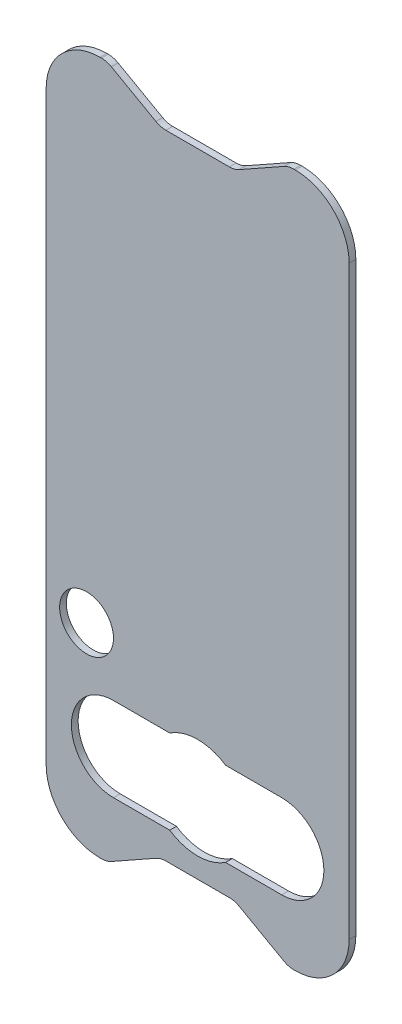
ISO-10303-21;
HEADER;
FILE_DESCRIPTION(('STEP AP214'),'2;1');
FILE_NAME('part.step','',(''),(''),'','','');
FILE_SCHEMA(('AUTOMOTIVE_DESIGN { 1 0 10303 214 1 1 1 1 }'));
ENDSEC;
DATA;
#1=APPLICATION_CONTEXT('core data for automotive mechanical design processes');
#2=APPLICATION_PROTOCOL_DEFINITION('international standard','automotive_design',2000,#1);
#3=PRODUCT_CONTEXT('',#1,'mechanical');
#4=PRODUCT('Part','Part','',(#3));
#5=PRODUCT_RELATED_PRODUCT_CATEGORY('part','',(#4));
#6=PRODUCT_DEFINITION_FORMATION('','',#4);
#7=PRODUCT_DEFINITION_CONTEXT('part definition',#1,'design');
#8=PRODUCT_DEFINITION('design','',#6,#7);
#9=PRODUCT_DEFINITION_SHAPE('','',#8);
#10=(LENGTH_UNIT() NAMED_UNIT(*) SI_UNIT(.MILLI.,.METRE.));
#11=(NAMED_UNIT(*) PLANE_ANGLE_UNIT() SI_UNIT($,.RADIAN.));
#12=(NAMED_UNIT(*) SI_UNIT($,.STERADIAN.) SOLID_ANGLE_UNIT());
#13=UNCERTAINTY_MEASURE_WITH_UNIT(LENGTH_MEASURE(1.E-05),#10,'distance_accuracy_value','');
#14=(GEOMETRIC_REPRESENTATION_CONTEXT(3) GLOBAL_UNCERTAINTY_ASSIGNED_CONTEXT((#13)) GLOBAL_UNIT_ASSIGNED_CONTEXT((#10,
#11,#12)) REPRESENTATION_CONTEXT('',''));
#15=CARTESIAN_POINT('',(0.,0.,0.));
#16=DIRECTION('',(0.,0.,1.));
#17=DIRECTION('',(1.,0.,0.));
#18=AXIS2_PLACEMENT_3D('',#15,#16,#17);
#19=CARTESIAN_POINT('',(0.,0.,1.));
#20=DIRECTION('',(0.,1.,0.));
#21=DIRECTION('',(0.,0.,1.));
#22=AXIS2_PLACEMENT_3D('',#19,#20,#21);
#23=PLANE('',#22);
#24=DIRECTION('',(1.,0.,0.));
#25=VECTOR('',#24,1.);
#26=CARTESIAN_POINT('',(0.,0.,1.));
#27=LINE('',#26,#25);
#28=CARTESIAN_POINT('',(36.7858532502286,0.,1.));
#29=VERTEX_POINT('',#28);
#30=CARTESIAN_POINT('',(37.,0.,1.));
#31=VERTEX_POINT('',#30);
#32=EDGE_CURVE('E358',#29,#31,#27,.T.);
#33=ORIENTED_EDGE('',*,*,#32,.F.);
#34=DIRECTION('',(0.,0.,1.));
#35=VECTOR('',#34,1.);
#36=CARTESIAN_POINT('',(36.7858532502286,0.,1.));
#37=LINE('',#36,#35);
#38=CARTESIAN_POINT('',(36.7858532502286,0.,0.));
#39=VERTEX_POINT('',#38);
#40=EDGE_CURVE('E456',#29,#39,#37,.F.);
#41=ORIENTED_EDGE('',*,*,#40,.T.);
#42=DIRECTION('',(1.,0.,0.));
#43=VECTOR('',#42,1.);
#44=CARTESIAN_POINT('',(0.,0.,0.));
#45=LINE('',#44,#43);
#46=CARTESIAN_POINT('',(37.,0.,0.));
#47=VERTEX_POINT('',#46);
#48=EDGE_CURVE('E373',#39,#47,#45,.T.);
#49=ORIENTED_EDGE('',*,*,#48,.T.);
#50=DIRECTION('',(0.,0.,-1.));
#51=VECTOR('',#50,1.);
#52=CARTESIAN_POINT('',(37.,0.,1.));
#53=LINE('',#52,#51);
#54=EDGE_CURVE('E370',#47,#31,#53,.F.);
#55=ORIENTED_EDGE('',*,*,#54,.T.);
#56=EDGE_LOOP('',(#33,#41,#49,#55));
#57=FACE_BOUND('',#56,.T.);
#58=ADVANCED_FACE('F33',(#57),#23,.F.);
#59=CARTESIAN_POINT('',(0.,103.,1.));
#60=DIRECTION('',(0.,-1.,0.));
#61=DIRECTION('',(0.,0.,-1.));
#62=AXIS2_PLACEMENT_3D('',#59,#60,#61);
#63=PLANE('',#62);
#64=DIRECTION('',(-1.,0.,0.));
#65=VECTOR('',#64,1.);
#66=CARTESIAN_POINT('',(0.,103.,0.));
#67=LINE('',#66,#65);
#68=CARTESIAN_POINT('',(37.,103.,0.));
#69=VERTEX_POINT('',#68);
#70=CARTESIAN_POINT('',(36.7858532502285,103.,0.));
#71=VERTEX_POINT('',#70);
#72=EDGE_CURVE('E359',#69,#71,#67,.T.);
#73=ORIENTED_EDGE('',*,*,#72,.T.);
#74=DIRECTION('',(0.,0.,1.));
#75=VECTOR('',#74,1.);
#76=CARTESIAN_POINT('',(36.7858532502286,103.,1.));
#77=LINE('',#76,#75);
#78=CARTESIAN_POINT('',(36.7858532502285,103.,1.));
#79=VERTEX_POINT('',#78);
#80=EDGE_CURVE('E458',#71,#79,#77,.T.);
#81=ORIENTED_EDGE('',*,*,#80,.T.);
#82=DIRECTION('',(-1.,0.,0.));
#83=VECTOR('',#82,1.);
#84=CARTESIAN_POINT('',(0.,103.,1.));
#85=LINE('',#84,#83);
#86=CARTESIAN_POINT('',(37.,103.,1.));
#87=VERTEX_POINT('',#86);
#88=EDGE_CURVE('E367',#87,#79,#85,.T.);
#89=ORIENTED_EDGE('',*,*,#88,.F.);
#90=DIRECTION('',(0.,0.,-1.));
#91=VECTOR('',#90,1.);
#92=CARTESIAN_POINT('',(37.,103.,1.));
#93=LINE('',#92,#91);
#94=EDGE_CURVE('E419',#87,#69,#93,.T.);
#95=ORIENTED_EDGE('',*,*,#94,.T.);
#96=EDGE_LOOP('',(#73,#81,#89,#95));
#97=FACE_BOUND('',#96,.T.);
#98=ADVANCED_FACE('F518',(#97),#63,.F.);
#99=CARTESIAN_POINT('',(0.,0.,1.));
#100=DIRECTION('',(0.,0.,-1.));
#101=DIRECTION('',(-1.,0.,0.));
#102=AXIS2_PLACEMENT_3D('',#99,#100,#101);
#103=PLANE('',#102);
#104=CARTESIAN_POINT('',(5.99999999999999,29.25,1.));
#105=DIRECTION('',(0.,0.,1.));
#106=DIRECTION('',(1.,0.,0.));
#107=AXIS2_PLACEMENT_3D('',#104,#105,#106);
#108=CIRCLE('',#107,4.);
#109=CARTESIAN_POINT('',(9.99999999999999,29.25,1.));
#110=VERTEX_POINT('',#109);
#111=EDGE_CURVE('E324',#110,#110,#108,.T.);
#112=ORIENTED_EDGE('',*,*,#111,.F.);
#113=EDGE_LOOP('',(#112));
#114=FACE_BOUND('',#113,.T.);
#115=CARTESIAN_POINT('',(8.,0.,1.));
#116=VERTEX_POINT('',#115);
#117=CARTESIAN_POINT('',(8.21414674977138,0.,1.));
#118=VERTEX_POINT('',#117);
#119=EDGE_CURVE('E360',#116,#118,#27,.T.);
#120=ORIENTED_EDGE('',*,*,#119,.T.);
#121=CARTESIAN_POINT('',(8.21414674977139,3.,1.));
#122=DIRECTION('',(0.,0.,-1.));
#123=DIRECTION('',(-1.,0.,0.));
#124=AXIS2_PLACEMENT_3D('',#121,#122,#123);
#125=CIRCLE('',#124,3.);
#126=CARTESIAN_POINT('',(9.68493046866906,0.385273388626352,1.));
#127=VERTEX_POINT('',#126);
#128=EDGE_CURVE('E446',#118,#127,#125,.F.);
#129=ORIENTED_EDGE('',*,*,#128,.T.);
#130=DIRECTION('',(-0.871575537124549,-0.490261239632559,0.));
#131=VECTOR('',#130,1.);
#132=CARTESIAN_POINT('',(17.,4.5,1.));
#133=LINE('',#132,#131);
#134=CARTESIAN_POINT('',(16.3150695313309,4.11472661137365,1.));
#135=VERTEX_POINT('',#134);
#136=EDGE_CURVE('E337',#135,#127,#133,.T.);
#137=ORIENTED_EDGE('',*,*,#136,.F.);
#138=CARTESIAN_POINT('',(17.7858532502286,1.5,1.));
#139=DIRECTION('',(0.,0.,-1.));
#140=DIRECTION('',(-1.,0.,0.));
#141=AXIS2_PLACEMENT_3D('',#138,#139,#140);
#142=CIRCLE('',#141,3.);
#143=CARTESIAN_POINT('',(17.7858532502286,4.5,1.));
#144=VERTEX_POINT('',#143);
#145=EDGE_CURVE('E481',#135,#144,#142,.T.);
#146=ORIENTED_EDGE('',*,*,#145,.T.);
#147=DIRECTION('',(-1.,0.,0.));
#148=VECTOR('',#147,1.);
#149=CARTESIAN_POINT('',(17.,4.5,1.));
#150=LINE('',#149,#148);
#151=CARTESIAN_POINT('',(27.2141467497714,4.50000000000001,1.));
#152=VERTEX_POINT('',#151);
#153=EDGE_CURVE('E344',#152,#144,#150,.T.);
#154=ORIENTED_EDGE('',*,*,#153,.F.);
#155=CARTESIAN_POINT('',(27.2141467497714,1.50000000000001,1.));
#156=DIRECTION('',(0.,0.,-1.));
#157=DIRECTION('',(-1.,0.,0.));
#158=AXIS2_PLACEMENT_3D('',#155,#156,#157);
#159=CIRCLE('',#158,3.);
#160=CARTESIAN_POINT('',(28.6849304686691,4.11472661137365,1.));
#161=VERTEX_POINT('',#160);
#162=EDGE_CURVE('E477',#152,#161,#159,.T.);
#163=ORIENTED_EDGE('',*,*,#162,.T.);
#164=DIRECTION('',(-0.871575537124549,0.490261239632559,0.));
#165=VECTOR('',#164,1.);
#166=CARTESIAN_POINT('',(28.,4.50000000000001,1.));
#167=LINE('',#166,#165);
#168=CARTESIAN_POINT('',(35.3150695313309,0.38527338862635,1.));
#169=VERTEX_POINT('',#168);
#170=EDGE_CURVE('E303',#169,#161,#167,.T.);
#171=ORIENTED_EDGE('',*,*,#170,.F.);
#172=CARTESIAN_POINT('',(36.7858532502286,3.,1.));
#173=DIRECTION('',(0.,0.,-1.));
#174=DIRECTION('',(-1.,0.,0.));
#175=AXIS2_PLACEMENT_3D('',#172,#173,#174);
#176=CIRCLE('',#175,3.);
#177=EDGE_CURVE('E444',#169,#29,#176,.F.);
#178=ORIENTED_EDGE('',*,*,#177,.T.);
#179=ORIENTED_EDGE('',*,*,#32,.T.);
#180=CARTESIAN_POINT('',(37.,8.,1.));
#181=DIRECTION('',(0.,0.,-1.));
#182=DIRECTION('',(-1.,0.,0.));
#183=AXIS2_PLACEMENT_3D('',#180,#181,#182);
#184=CIRCLE('',#183,8.);
#185=CARTESIAN_POINT('',(45.,8.,1.));
#186=VERTEX_POINT('',#185);
#187=EDGE_CURVE('E407',#31,#186,#184,.F.);
#188=ORIENTED_EDGE('',*,*,#187,.T.);
#189=DIRECTION('',(0.,1.,0.));
#190=VECTOR('',#189,1.);
#191=CARTESIAN_POINT('',(45.,0.,1.));
#192=LINE('',#191,#190);
#193=CARTESIAN_POINT('',(45.,95.,1.));
#194=VERTEX_POINT('',#193);
#195=EDGE_CURVE('E363',#186,#194,#192,.T.);
#196=ORIENTED_EDGE('',*,*,#195,.T.);
#197=CARTESIAN_POINT('',(37.,95.,1.));
#198=DIRECTION('',(0.,0.,-1.));
#199=DIRECTION('',(-1.,0.,0.));
#200=AXIS2_PLACEMENT_3D('',#197,#198,#199);
#201=CIRCLE('',#200,8.);
#202=EDGE_CURVE('E405',#194,#87,#201,.F.);
#203=ORIENTED_EDGE('',*,*,#202,.T.);
#204=ORIENTED_EDGE('',*,*,#88,.T.);
#205=CARTESIAN_POINT('',(36.7858532502286,100.,1.));
#206=DIRECTION('',(0.,0.,-1.));
#207=DIRECTION('',(-1.,0.,0.));
#208=AXIS2_PLACEMENT_3D('',#205,#206,#207);
#209=CIRCLE('',#208,3.);
#210=CARTESIAN_POINT('',(35.3150695313309,102.614726611374,1.));
#211=VERTEX_POINT('',#210);
#212=EDGE_CURVE('E442',#79,#211,#209,.F.);
#213=ORIENTED_EDGE('',*,*,#212,.T.);
#214=DIRECTION('',(0.871575537124549,0.490261239632559,0.));
#215=VECTOR('',#214,1.);
#216=CARTESIAN_POINT('',(36.,103.,1.));
#217=LINE('',#216,#215);
#218=CARTESIAN_POINT('',(28.6849304686691,98.8852733886264,1.));
#219=VERTEX_POINT('',#218);
#220=EDGE_CURVE('E325',#219,#211,#217,.T.);
#221=ORIENTED_EDGE('',*,*,#220,.F.);
#222=CARTESIAN_POINT('',(27.2141467497714,101.5,1.));
#223=DIRECTION('',(0.,0.,-1.));
#224=DIRECTION('',(-1.,0.,0.));
#225=AXIS2_PLACEMENT_3D('',#222,#223,#224);
#226=CIRCLE('',#225,3.);
#227=CARTESIAN_POINT('',(27.2141467497714,98.5,1.));
#228=VERTEX_POINT('',#227);
#229=EDGE_CURVE('E485',#219,#228,#226,.T.);
#230=ORIENTED_EDGE('',*,*,#229,.T.);
#231=DIRECTION('',(1.,0.,0.));
#232=VECTOR('',#231,1.);
#233=CARTESIAN_POINT('',(17.,98.5,1.));
#234=LINE('',#233,#232);
#235=CARTESIAN_POINT('',(17.7858532502286,98.5,1.));
#236=VERTEX_POINT('',#235);
#237=EDGE_CURVE('E320',#236,#228,#234,.T.);
#238=ORIENTED_EDGE('',*,*,#237,.F.);
#239=CARTESIAN_POINT('',(17.7858532502286,101.5,1.));
#240=DIRECTION('',(0.,0.,-1.));
#241=DIRECTION('',(-1.,0.,0.));
#242=AXIS2_PLACEMENT_3D('',#239,#240,#241);
#243=CIRCLE('',#242,3.);
#244=CARTESIAN_POINT('',(16.3150695313309,98.8852733886264,1.));
#245=VERTEX_POINT('',#244);
#246=EDGE_CURVE('E41',#236,#245,#243,.T.);
#247=ORIENTED_EDGE('',*,*,#246,.T.);
#248=DIRECTION('',(0.87157553712455,-0.490261239632558,0.));
#249=VECTOR('',#248,1.);
#250=CARTESIAN_POINT('',(8.99999999999999,103.,1.));
#251=LINE('',#250,#249);
#252=CARTESIAN_POINT('',(9.68493046866907,102.614726611374,1.));
#253=VERTEX_POINT('',#252);
#254=EDGE_CURVE('E328',#253,#245,#251,.T.);
#255=ORIENTED_EDGE('',*,*,#254,.F.);
#256=CARTESIAN_POINT('',(8.2141467497714,100.,1.));
#257=DIRECTION('',(0.,0.,-1.));
#258=DIRECTION('',(-1.,0.,0.));
#259=AXIS2_PLACEMENT_3D('',#256,#257,#258);
#260=CIRCLE('',#259,3.);
#261=CARTESIAN_POINT('',(8.2141467497714,103.,1.));
#262=VERTEX_POINT('',#261);
#263=EDGE_CURVE('E440',#253,#262,#260,.F.);
#264=ORIENTED_EDGE('',*,*,#263,.T.);
#265=CARTESIAN_POINT('',(8.,103.,1.));
#266=VERTEX_POINT('',#265);
#267=EDGE_CURVE('E366',#262,#266,#85,.T.);
#268=ORIENTED_EDGE('',*,*,#267,.T.);
#269=CARTESIAN_POINT('',(8.,95.,1.));
#270=DIRECTION('',(0.,0.,-1.));
#271=DIRECTION('',(-1.,0.,0.));
#272=AXIS2_PLACEMENT_3D('',#269,#270,#271);
#273=CIRCLE('',#272,8.);
#274=CARTESIAN_POINT('',(0.,95.,1.));
#275=VERTEX_POINT('',#274);
#276=EDGE_CURVE('E403',#266,#275,#273,.F.);
#277=ORIENTED_EDGE('',*,*,#276,.T.);
#278=DIRECTION('',(0.,-1.,0.));
#279=VECTOR('',#278,1.);
#280=CARTESIAN_POINT('',(0.,0.,1.));
#281=LINE('',#280,#279);
#282=CARTESIAN_POINT('',(0.,8.,1.));
#283=VERTEX_POINT('',#282);
#284=EDGE_CURVE('E355',#275,#283,#281,.T.);
#285=ORIENTED_EDGE('',*,*,#284,.T.);
#286=CARTESIAN_POINT('',(8.,8.,1.));
#287=DIRECTION('',(0.,0.,-1.));
#288=DIRECTION('',(-1.,0.,0.));
#289=AXIS2_PLACEMENT_3D('',#286,#287,#288);
#290=CIRCLE('',#289,8.);
#291=EDGE_CURVE('E409',#283,#116,#290,.F.);
#292=ORIENTED_EDGE('',*,*,#291,.T.);
#293=EDGE_LOOP('',(#120,#129,#137,#146,#154,#163,#171,#178,#179,#188,#196,#203,#204,#213,#221,
#230,#238,#247,#255,#264,#268,#277,#285,#292));
#294=FACE_BOUND('',#293,.T.);
#295=DIRECTION('',(-1.,0.,0.));
#296=VECTOR('',#295,1.);
#297=CARTESIAN_POINT('',(10.,21.25,1.));
#298=LINE('',#297,#296);
#299=CARTESIAN_POINT('',(18.3542190120558,21.25,1.));
#300=VERTEX_POINT('',#299);
#301=CARTESIAN_POINT('',(10.,21.25,1.));
#302=VERTEX_POINT('',#301);
#303=EDGE_CURVE('E293',#300,#302,#298,.T.);
#304=ORIENTED_EDGE('',*,*,#303,.F.);
#305=CARTESIAN_POINT('',(22.5,15.,1.));
#306=DIRECTION('',(0.,0.,1.));
#307=DIRECTION('',(-1.,0.,0.));
#308=AXIS2_PLACEMENT_3D('',#305,#306,#307);
#309=CIRCLE('',#308,7.5);
#310=CARTESIAN_POINT('',(26.6457809879442,21.25,1.));
#311=VERTEX_POINT('',#310);
#312=EDGE_CURVE('E291',#311,#300,#309,.T.);
#313=ORIENTED_EDGE('',*,*,#312,.F.);
#314=DIRECTION('',(-1.,0.,0.));
#315=VECTOR('',#314,1.);
#316=CARTESIAN_POINT('',(26.6457809879442,21.25,1.));
#317=LINE('',#316,#315);
#318=CARTESIAN_POINT('',(35.,21.25,1.));
#319=VERTEX_POINT('',#318);
#320=EDGE_CURVE('E288',#319,#311,#317,.T.);
#321=ORIENTED_EDGE('',*,*,#320,.F.);
#322=CARTESIAN_POINT('',(35.,15.,1.));
#323=DIRECTION('',(0.,0.,1.));
#324=DIRECTION('',(-1.,0.,0.));
#325=AXIS2_PLACEMENT_3D('',#322,#323,#324);
#326=CIRCLE('',#325,6.25);
#327=CARTESIAN_POINT('',(35.,8.75,1.));
#328=VERTEX_POINT('',#327);
#329=EDGE_CURVE('E285',#328,#319,#326,.T.);
#330=ORIENTED_EDGE('',*,*,#329,.F.);
#331=DIRECTION('',(1.,0.,0.));
#332=VECTOR('',#331,1.);
#333=CARTESIAN_POINT('',(26.6457809879442,8.75,1.));
#334=LINE('',#333,#332);
#335=CARTESIAN_POINT('',(26.6457809879442,8.75,1.));
#336=VERTEX_POINT('',#335);
#337=EDGE_CURVE('E283',#336,#328,#334,.T.);
#338=ORIENTED_EDGE('',*,*,#337,.F.);
#339=CARTESIAN_POINT('',(22.5,15.,1.));
#340=DIRECTION('',(0.,0.,1.));
#341=DIRECTION('',(1.,0.,0.));
#342=AXIS2_PLACEMENT_3D('',#339,#340,#341);
#343=CIRCLE('',#342,7.5);
#344=CARTESIAN_POINT('',(18.3542190120558,8.75,1.));
#345=VERTEX_POINT('',#344);
#346=EDGE_CURVE('E259',#345,#336,#343,.T.);
#347=ORIENTED_EDGE('',*,*,#346,.F.);
#348=DIRECTION('',(1.,0.,0.));
#349=VECTOR('',#348,1.);
#350=CARTESIAN_POINT('',(10.,8.75,1.));
#351=LINE('',#350,#349);
#352=CARTESIAN_POINT('',(10.,8.75,1.));
#353=VERTEX_POINT('',#352);
#354=EDGE_CURVE('E253',#353,#345,#351,.T.);
#355=ORIENTED_EDGE('',*,*,#354,.F.);
#356=CARTESIAN_POINT('',(10.,15.,1.));
#357=DIRECTION('',(0.,0.,1.));
#358=DIRECTION('',(1.,0.,0.));
#359=AXIS2_PLACEMENT_3D('',#356,#357,#358);
#360=CIRCLE('',#359,6.25);
#361=EDGE_CURVE('E296',#302,#353,#360,.T.);
#362=ORIENTED_EDGE('',*,*,#361,.F.);
#363=EDGE_LOOP('',(#304,#313,#321,#330,#338,#347,#355,#362));
#364=FACE_BOUND('',#363,.T.);
#365=ADVANCED_FACE('F491',(#114,#294,#364),#103,.F.);
#366=CARTESIAN_POINT('',(0.,0.,0.));
#367=DIRECTION('',(0.,0.,-1.));
#368=DIRECTION('',(-1.,0.,0.));
#369=AXIS2_PLACEMENT_3D('',#366,#367,#368);
#370=PLANE('',#369);
#371=CARTESIAN_POINT('',(22.5,15.,0.));
#372=DIRECTION('',(0.,0.,1.));
#373=DIRECTION('',(-1.,0.,0.));
#374=AXIS2_PLACEMENT_3D('',#371,#372,#373);
#375=CIRCLE('',#374,7.5);
#376=CARTESIAN_POINT('',(26.6457809879442,21.25,0.));
#377=VERTEX_POINT('',#376);
#378=CARTESIAN_POINT('',(18.3542190120558,21.25,0.));
#379=VERTEX_POINT('',#378);
#380=EDGE_CURVE('E274',#377,#379,#375,.T.);
#381=ORIENTED_EDGE('',*,*,#380,.T.);
#382=DIRECTION('',(-1.,0.,0.));
#383=VECTOR('',#382,1.);
#384=CARTESIAN_POINT('',(10.,21.25,0.));
#385=LINE('',#384,#383);
#386=CARTESIAN_POINT('',(10.,21.25,0.));
#387=VERTEX_POINT('',#386);
#388=EDGE_CURVE('E276',#379,#387,#385,.T.);
#389=ORIENTED_EDGE('',*,*,#388,.T.);
#390=CARTESIAN_POINT('',(10.,15.,0.));
#391=DIRECTION('',(0.,0.,1.));
#392=DIRECTION('',(1.,0.,0.));
#393=AXIS2_PLACEMENT_3D('',#390,#391,#392);
#394=CIRCLE('',#393,6.25);
#395=CARTESIAN_POINT('',(10.,8.75,0.));
#396=VERTEX_POINT('',#395);
#397=EDGE_CURVE('E279',#387,#396,#394,.T.);
#398=ORIENTED_EDGE('',*,*,#397,.T.);
#399=DIRECTION('',(1.,0.,0.));
#400=VECTOR('',#399,1.);
#401=CARTESIAN_POINT('',(10.,8.75,0.));
#402=LINE('',#401,#400);
#403=CARTESIAN_POINT('',(18.3542190120558,8.75,0.));
#404=VERTEX_POINT('',#403);
#405=EDGE_CURVE('E250',#396,#404,#402,.T.);
#406=ORIENTED_EDGE('',*,*,#405,.T.);
#407=CARTESIAN_POINT('',(22.5,15.,0.));
#408=DIRECTION('',(0.,0.,1.));
#409=DIRECTION('',(1.,0.,0.));
#410=AXIS2_PLACEMENT_3D('',#407,#408,#409);
#411=CIRCLE('',#410,7.5);
#412=CARTESIAN_POINT('',(26.6457809879442,8.75,0.));
#413=VERTEX_POINT('',#412);
#414=EDGE_CURVE('E242',#404,#413,#411,.T.);
#415=ORIENTED_EDGE('',*,*,#414,.T.);
#416=DIRECTION('',(1.,0.,0.));
#417=VECTOR('',#416,1.);
#418=CARTESIAN_POINT('',(26.6457809879442,8.75,0.));
#419=LINE('',#418,#417);
#420=CARTESIAN_POINT('',(35.,8.75,0.));
#421=VERTEX_POINT('',#420);
#422=EDGE_CURVE('E247',#413,#421,#419,.T.);
#423=ORIENTED_EDGE('',*,*,#422,.T.);
#424=CARTESIAN_POINT('',(35.,15.,0.));
#425=DIRECTION('',(0.,0.,1.));
#426=DIRECTION('',(-1.,0.,0.));
#427=AXIS2_PLACEMENT_3D('',#424,#425,#426);
#428=CIRCLE('',#427,6.25);
#429=CARTESIAN_POINT('',(35.,21.25,0.));
#430=VERTEX_POINT('',#429);
#431=EDGE_CURVE('E267',#421,#430,#428,.T.);
#432=ORIENTED_EDGE('',*,*,#431,.T.);
#433=DIRECTION('',(-1.,0.,0.));
#434=VECTOR('',#433,1.);
#435=CARTESIAN_POINT('',(26.6457809879442,21.25,0.));
#436=LINE('',#435,#434);
#437=EDGE_CURVE('E269',#430,#377,#436,.T.);
#438=ORIENTED_EDGE('',*,*,#437,.T.);
#439=EDGE_LOOP('',(#381,#389,#398,#406,#415,#423,#432,#438));
#440=FACE_BOUND('',#439,.T.);
#441=DIRECTION('',(-0.871575537124549,-0.490261239632559,0.));
#442=VECTOR('',#441,1.);
#443=CARTESIAN_POINT('',(17.,4.5,0.));
#444=LINE('',#443,#442);
#445=CARTESIAN_POINT('',(16.3150695313309,4.11472661137365,0.));
#446=VERTEX_POINT('',#445);
#447=CARTESIAN_POINT('',(9.68493046866906,0.385273388626352,0.));
#448=VERTEX_POINT('',#447);
#449=EDGE_CURVE('E329',#446,#448,#444,.T.);
#450=ORIENTED_EDGE('',*,*,#449,.T.);
#451=CARTESIAN_POINT('',(8.21414674977139,3.,0.));
#452=DIRECTION('',(0.,0.,-1.));
#453=DIRECTION('',(-1.,0.,0.));
#454=AXIS2_PLACEMENT_3D('',#451,#452,#453);
#455=CIRCLE('',#454,3.);
#456=CARTESIAN_POINT('',(8.21414674977138,0.,0.));
#457=VERTEX_POINT('',#456);
#458=EDGE_CURVE('E454',#448,#457,#455,.T.);
#459=ORIENTED_EDGE('',*,*,#458,.T.);
#460=CARTESIAN_POINT('',(8.,0.,0.));
#461=VERTEX_POINT('',#460);
#462=EDGE_CURVE('E374',#461,#457,#45,.T.);
#463=ORIENTED_EDGE('',*,*,#462,.F.);
#464=CARTESIAN_POINT('',(8.,8.,0.));
#465=DIRECTION('',(0.,0.,-1.));
#466=DIRECTION('',(-1.,0.,0.));
#467=AXIS2_PLACEMENT_3D('',#464,#465,#466);
#468=CIRCLE('',#467,8.);
#469=CARTESIAN_POINT('',(0.,8.,0.));
#470=VERTEX_POINT('',#469);
#471=EDGE_CURVE('E396',#461,#470,#468,.T.);
#472=ORIENTED_EDGE('',*,*,#471,.T.);
#473=DIRECTION('',(0.,-1.,0.));
#474=VECTOR('',#473,1.);
#475=CARTESIAN_POINT('',(0.,0.,0.));
#476=LINE('',#475,#474);
#477=CARTESIAN_POINT('',(0.,95.,0.));
#478=VERTEX_POINT('',#477);
#479=EDGE_CURVE('E352',#478,#470,#476,.T.);
#480=ORIENTED_EDGE('',*,*,#479,.F.);
#481=CARTESIAN_POINT('',(8.,95.,0.));
#482=DIRECTION('',(0.,0.,-1.));
#483=DIRECTION('',(-1.,0.,0.));
#484=AXIS2_PLACEMENT_3D('',#481,#482,#483);
#485=CIRCLE('',#484,8.);
#486=CARTESIAN_POINT('',(8.,103.,0.));
#487=VERTEX_POINT('',#486);
#488=EDGE_CURVE('E388',#478,#487,#485,.T.);
#489=ORIENTED_EDGE('',*,*,#488,.T.);
#490=CARTESIAN_POINT('',(8.2141467497714,103.,0.));
#491=VERTEX_POINT('',#490);
#492=EDGE_CURVE('E380',#491,#487,#67,.T.);
#493=ORIENTED_EDGE('',*,*,#492,.F.);
#494=CARTESIAN_POINT('',(8.2141467497714,100.,0.));
#495=DIRECTION('',(0.,0.,-1.));
#496=DIRECTION('',(-1.,0.,0.));
#497=AXIS2_PLACEMENT_3D('',#494,#495,#496);
#498=CIRCLE('',#497,3.);
#499=CARTESIAN_POINT('',(9.68493046866907,102.614726611374,0.));
#500=VERTEX_POINT('',#499);
#501=EDGE_CURVE('E448',#491,#500,#498,.T.);
#502=ORIENTED_EDGE('',*,*,#501,.T.);
#503=DIRECTION('',(0.87157553712455,-0.490261239632558,0.));
#504=VECTOR('',#503,1.);
#505=CARTESIAN_POINT('',(8.99999999999999,103.,0.));
#506=LINE('',#505,#504);
#507=CARTESIAN_POINT('',(16.3150695313309,98.8852733886264,0.));
#508=VERTEX_POINT('',#507);
#509=EDGE_CURVE('E319',#500,#508,#506,.T.);
#510=ORIENTED_EDGE('',*,*,#509,.T.);
#511=CARTESIAN_POINT('',(17.7858532502286,101.5,0.));
#512=DIRECTION('',(0.,0.,-1.));
#513=DIRECTION('',(-1.,0.,0.));
#514=AXIS2_PLACEMENT_3D('',#511,#512,#513);
#515=CIRCLE('',#514,3.);
#516=CARTESIAN_POINT('',(17.7858532502286,98.5,0.));
#517=VERTEX_POINT('',#516);
#518=EDGE_CURVE('E11',#508,#517,#515,.F.);
#519=ORIENTED_EDGE('',*,*,#518,.T.);
#520=DIRECTION('',(1.,0.,0.));
#521=VECTOR('',#520,1.);
#522=CARTESIAN_POINT('',(17.,98.5,0.));
#523=LINE('',#522,#521);
#524=CARTESIAN_POINT('',(27.2141467497714,98.5,0.));
#525=VERTEX_POINT('',#524);
#526=EDGE_CURVE('E322',#517,#525,#523,.T.);
#527=ORIENTED_EDGE('',*,*,#526,.T.);
#528=CARTESIAN_POINT('',(27.2141467497714,101.5,0.));
#529=DIRECTION('',(0.,0.,-1.));
#530=DIRECTION('',(-1.,0.,0.));
#531=AXIS2_PLACEMENT_3D('',#528,#529,#530);
#532=CIRCLE('',#531,3.);
#533=CARTESIAN_POINT('',(28.6849304686691,98.8852733886264,0.));
#534=VERTEX_POINT('',#533);
#535=EDGE_CURVE('E487',#525,#534,#532,.F.);
#536=ORIENTED_EDGE('',*,*,#535,.T.);
#537=DIRECTION('',(0.871575537124549,0.490261239632559,0.));
#538=VECTOR('',#537,1.);
#539=CARTESIAN_POINT('',(36.,103.,0.));
#540=LINE('',#539,#538);
#541=CARTESIAN_POINT('',(35.3150695313309,102.614726611374,0.));
#542=VERTEX_POINT('',#541);
#543=EDGE_CURVE('E316',#534,#542,#540,.T.);
#544=ORIENTED_EDGE('',*,*,#543,.T.);
#545=CARTESIAN_POINT('',(36.7858532502286,100.,0.));
#546=DIRECTION('',(0.,0.,-1.));
#547=DIRECTION('',(-1.,0.,0.));
#548=AXIS2_PLACEMENT_3D('',#545,#546,#547);
#549=CIRCLE('',#548,3.);
#550=EDGE_CURVE('E450',#542,#71,#549,.T.);
#551=ORIENTED_EDGE('',*,*,#550,.T.);
#552=ORIENTED_EDGE('',*,*,#72,.F.);
#553=CARTESIAN_POINT('',(37.,95.,0.));
#554=DIRECTION('',(0.,0.,-1.));
#555=DIRECTION('',(-1.,0.,0.));
#556=AXIS2_PLACEMENT_3D('',#553,#554,#555);
#557=CIRCLE('',#556,8.);
#558=CARTESIAN_POINT('',(45.,95.,0.));
#559=VERTEX_POINT('',#558);
#560=EDGE_CURVE('E391',#69,#559,#557,.T.);
#561=ORIENTED_EDGE('',*,*,#560,.T.);
#562=DIRECTION('',(0.,1.,0.));
#563=VECTOR('',#562,1.);
#564=CARTESIAN_POINT('',(45.,0.,0.));
#565=LINE('',#564,#563);
#566=CARTESIAN_POINT('',(45.,8.,0.));
#567=VERTEX_POINT('',#566);
#568=EDGE_CURVE('E377',#567,#559,#565,.T.);
#569=ORIENTED_EDGE('',*,*,#568,.F.);
#570=CARTESIAN_POINT('',(37.,8.,0.));
#571=DIRECTION('',(0.,0.,-1.));
#572=DIRECTION('',(-1.,0.,0.));
#573=AXIS2_PLACEMENT_3D('',#570,#571,#572);
#574=CIRCLE('',#573,8.);
#575=EDGE_CURVE('E393',#567,#47,#574,.T.);
#576=ORIENTED_EDGE('',*,*,#575,.T.);
#577=ORIENTED_EDGE('',*,*,#48,.F.);
#578=CARTESIAN_POINT('',(36.7858532502286,3.,0.));
#579=DIRECTION('',(0.,0.,-1.));
#580=DIRECTION('',(-1.,0.,0.));
#581=AXIS2_PLACEMENT_3D('',#578,#579,#580);
#582=CIRCLE('',#581,3.);
#583=CARTESIAN_POINT('',(35.3150695313309,0.38527338862635,0.));
#584=VERTEX_POINT('',#583);
#585=EDGE_CURVE('E452',#39,#584,#582,.T.);
#586=ORIENTED_EDGE('',*,*,#585,.T.);
#587=DIRECTION('',(-0.871575537124549,0.490261239632559,0.));
#588=VECTOR('',#587,1.);
#589=CARTESIAN_POINT('',(28.,4.50000000000001,0.));
#590=LINE('',#589,#588);
#591=CARTESIAN_POINT('',(28.6849304686691,4.11472661137365,0.));
#592=VERTEX_POINT('',#591);
#593=EDGE_CURVE('E333',#584,#592,#590,.T.);
#594=ORIENTED_EDGE('',*,*,#593,.T.);
#595=CARTESIAN_POINT('',(27.2141467497714,1.50000000000001,0.));
#596=DIRECTION('',(0.,0.,-1.));
#597=DIRECTION('',(-1.,0.,0.));
#598=AXIS2_PLACEMENT_3D('',#595,#596,#597);
#599=CIRCLE('',#598,3.);
#600=CARTESIAN_POINT('',(27.2141467497714,4.50000000000001,0.));
#601=VERTEX_POINT('',#600);
#602=EDGE_CURVE('E479',#592,#601,#599,.F.);
#603=ORIENTED_EDGE('',*,*,#602,.T.);
#604=DIRECTION('',(-1.,0.,0.));
#605=VECTOR('',#604,1.);
#606=CARTESIAN_POINT('',(17.,4.5,0.));
#607=LINE('',#606,#605);
#608=CARTESIAN_POINT('',(17.7858532502286,4.5,0.));
#609=VERTEX_POINT('',#608);
#610=EDGE_CURVE('E336',#601,#609,#607,.T.);
#611=ORIENTED_EDGE('',*,*,#610,.T.);
#612=CARTESIAN_POINT('',(17.7858532502286,1.5,0.));
#613=DIRECTION('',(0.,0.,-1.));
#614=DIRECTION('',(-1.,0.,0.));
#615=AXIS2_PLACEMENT_3D('',#612,#613,#614);
#616=CIRCLE('',#615,3.);
#617=EDGE_CURVE('E483',#609,#446,#616,.F.);
#618=ORIENTED_EDGE('',*,*,#617,.T.);
#619=EDGE_LOOP('',(#450,#459,#463,#472,#480,#489,#493,#502,#510,#519,#527,#536,#544,#551,#552,
#561,#569,#576,#577,#586,#594,#603,#611,#618));
#620=FACE_BOUND('',#619,.T.);
#621=CARTESIAN_POINT('',(5.99999999999999,29.25,0.));
#622=DIRECTION('',(0.,0.,1.));
#623=DIRECTION('',(1.,0.,0.));
#624=AXIS2_PLACEMENT_3D('',#621,#622,#623);
#625=CIRCLE('',#624,4.);
#626=CARTESIAN_POINT('',(9.99999999999999,29.25,0.));
#627=VERTEX_POINT('',#626);
#628=EDGE_CURVE('E349',#627,#627,#625,.T.);
#629=ORIENTED_EDGE('',*,*,#628,.T.);
#630=EDGE_LOOP('',(#629));
#631=FACE_BOUND('',#630,.T.);
#632=ADVANCED_FACE('F244',(#440,#620,#631),#370,.T.);
#633=CARTESIAN_POINT('',(0.,0.,1.));
#634=DIRECTION('',(1.,0.,0.));
#635=DIRECTION('',(0.,0.,-1.));
#636=AXIS2_PLACEMENT_3D('',#633,#634,#635);
#637=PLANE('',#636);
#638=ORIENTED_EDGE('',*,*,#479,.T.);
#639=DIRECTION('',(0.,0.,-1.));
#640=VECTOR('',#639,1.);
#641=CARTESIAN_POINT('',(0.,8.,1.));
#642=LINE('',#641,#640);
#643=EDGE_CURVE('E401',#470,#283,#642,.F.);
#644=ORIENTED_EDGE('',*,*,#643,.T.);
#645=ORIENTED_EDGE('',*,*,#284,.F.);
#646=DIRECTION('',(0.,0.,-1.));
#647=VECTOR('',#646,1.);
#648=CARTESIAN_POINT('',(0.,95.,1.));
#649=LINE('',#648,#647);
#650=EDGE_CURVE('E398',#275,#478,#649,.T.);
#651=ORIENTED_EDGE('',*,*,#650,.T.);
#652=EDGE_LOOP('',(#638,#644,#645,#651));
#653=FACE_BOUND('',#652,.T.);
#654=ADVANCED_FACE('F578',(#653),#637,.F.);
#655=ORIENTED_EDGE('',*,*,#462,.T.);
#656=DIRECTION('',(0.,0.,1.));
#657=VECTOR('',#656,1.);
#658=CARTESIAN_POINT('',(8.21414674977139,0.,1.));
#659=LINE('',#658,#657);
#660=EDGE_CURVE('E437',#457,#118,#659,.T.);
#661=ORIENTED_EDGE('',*,*,#660,.T.);
#662=ORIENTED_EDGE('',*,*,#119,.F.);
#663=DIRECTION('',(0.,0.,-1.));
#664=VECTOR('',#663,1.);
#665=CARTESIAN_POINT('',(8.,0.,1.));
#666=LINE('',#665,#664);
#667=EDGE_CURVE('E385',#116,#461,#666,.T.);
#668=ORIENTED_EDGE('',*,*,#667,.T.);
#669=EDGE_LOOP('',(#655,#661,#662,#668));
#670=FACE_BOUND('',#669,.T.);
#671=ADVANCED_FACE('F571',(#670),#23,.F.);
#672=CARTESIAN_POINT('',(45.,0.,1.));
#673=DIRECTION('',(-1.,0.,0.));
#674=DIRECTION('',(0.,0.,1.));
#675=AXIS2_PLACEMENT_3D('',#672,#673,#674);
#676=PLANE('',#675);
#677=ORIENTED_EDGE('',*,*,#195,.F.);
#678=DIRECTION('',(0.,0.,-1.));
#679=VECTOR('',#678,1.);
#680=CARTESIAN_POINT('',(45.,8.,1.));
#681=LINE('',#680,#679);
#682=EDGE_CURVE('E413',#186,#567,#681,.T.);
#683=ORIENTED_EDGE('',*,*,#682,.T.);
#684=ORIENTED_EDGE('',*,*,#568,.T.);
#685=DIRECTION('',(0.,0.,-1.));
#686=VECTOR('',#685,1.);
#687=CARTESIAN_POINT('',(45.,95.,1.));
#688=LINE('',#687,#686);
#689=EDGE_CURVE('E411',#559,#194,#688,.F.);
#690=ORIENTED_EDGE('',*,*,#689,.T.);
#691=EDGE_LOOP('',(#677,#683,#684,#690));
#692=FACE_BOUND('',#691,.T.);
#693=ADVANCED_FACE('F526',(#692),#676,.F.);
#694=ORIENTED_EDGE('',*,*,#267,.F.);
#695=DIRECTION('',(0.,0.,1.));
#696=VECTOR('',#695,1.);
#697=CARTESIAN_POINT('',(8.2141467497714,103.,1.));
#698=LINE('',#697,#696);
#699=EDGE_CURVE('E475',#262,#491,#698,.F.);
#700=ORIENTED_EDGE('',*,*,#699,.T.);
#701=ORIENTED_EDGE('',*,*,#492,.T.);
#702=DIRECTION('',(0.,0.,-1.));
#703=VECTOR('',#702,1.);
#704=CARTESIAN_POINT('',(8.,103.,1.));
#705=LINE('',#704,#703);
#706=EDGE_CURVE('E416',#487,#266,#705,.F.);
#707=ORIENTED_EDGE('',*,*,#706,.T.);
#708=EDGE_LOOP('',(#694,#700,#701,#707));
#709=FACE_BOUND('',#708,.T.);
#710=ADVANCED_FACE('F593',(#709),#63,.F.);
#711=CARTESIAN_POINT('',(8.,8.,1.));
#712=DIRECTION('',(0.,0.,-1.));
#713=DIRECTION('',(-1.,0.,0.));
#714=AXIS2_PLACEMENT_3D('',#711,#712,#713);
#715=CYLINDRICAL_SURFACE('',#714,8.);
#716=ORIENTED_EDGE('',*,*,#291,.F.);
#717=ORIENTED_EDGE('',*,*,#643,.F.);
#718=ORIENTED_EDGE('',*,*,#471,.F.);
#719=ORIENTED_EDGE('',*,*,#667,.F.);
#720=EDGE_LOOP('',(#716,#717,#718,#719));
#721=FACE_BOUND('',#720,.T.);
#722=ADVANCED_FACE('F582',(#721),#715,.T.);
#723=CARTESIAN_POINT('',(37.,8.,1.));
#724=DIRECTION('',(0.,0.,-1.));
#725=DIRECTION('',(-1.,0.,0.));
#726=AXIS2_PLACEMENT_3D('',#723,#724,#725);
#727=CYLINDRICAL_SURFACE('',#726,8.);
#728=ORIENTED_EDGE('',*,*,#187,.F.);
#729=ORIENTED_EDGE('',*,*,#54,.F.);
#730=ORIENTED_EDGE('',*,*,#575,.F.);
#731=ORIENTED_EDGE('',*,*,#682,.F.);
#732=EDGE_LOOP('',(#728,#729,#730,#731));
#733=FACE_BOUND('',#732,.T.);
#734=ADVANCED_FACE('F532',(#733),#727,.T.);
#735=CARTESIAN_POINT('',(37.,95.,1.));
#736=DIRECTION('',(0.,0.,-1.));
#737=DIRECTION('',(-1.,0.,0.));
#738=AXIS2_PLACEMENT_3D('',#735,#736,#737);
#739=CYLINDRICAL_SURFACE('',#738,8.);
#740=ORIENTED_EDGE('',*,*,#202,.F.);
#741=ORIENTED_EDGE('',*,*,#689,.F.);
#742=ORIENTED_EDGE('',*,*,#560,.F.);
#743=ORIENTED_EDGE('',*,*,#94,.F.);
#744=EDGE_LOOP('',(#740,#741,#742,#743));
#745=FACE_BOUND('',#744,.T.);
#746=ADVANCED_FACE('F529',(#745),#739,.T.);
#747=CARTESIAN_POINT('',(8.,95.,1.));
#748=DIRECTION('',(0.,0.,-1.));
#749=DIRECTION('',(-1.,0.,0.));
#750=AXIS2_PLACEMENT_3D('',#747,#748,#749);
#751=CYLINDRICAL_SURFACE('',#750,8.);
#752=ORIENTED_EDGE('',*,*,#276,.F.);
#753=ORIENTED_EDGE('',*,*,#706,.F.);
#754=ORIENTED_EDGE('',*,*,#488,.F.);
#755=ORIENTED_EDGE('',*,*,#650,.F.);
#756=EDGE_LOOP('',(#752,#753,#754,#755));
#757=FACE_BOUND('',#756,.T.);
#758=ADVANCED_FACE('F585',(#757),#751,.T.);
#759=CARTESIAN_POINT('',(5.99999999999999,29.25,0.));
#760=DIRECTION('',(0.,0.,1.));
#761=DIRECTION('',(1.,0.,0.));
#762=AXIS2_PLACEMENT_3D('',#759,#760,#761);
#763=CYLINDRICAL_SURFACE('',#762,4.);
#764=ORIENTED_EDGE('',*,*,#628,.F.);
#765=EDGE_LOOP('',(#764));
#766=FACE_BOUND('',#765,.T.);
#767=ORIENTED_EDGE('',*,*,#111,.T.);
#768=EDGE_LOOP('',(#767));
#769=FACE_BOUND('',#768,.T.);
#770=ADVANCED_FACE('F623',(#766,#769),#763,.F.);
#771=CARTESIAN_POINT('',(36.,103.,0.));
#772=DIRECTION('',(0.490261239632559,-0.871575537124549,0.));
#773=DIRECTION('',(0.871575537124549,0.490261239632559,0.));
#774=AXIS2_PLACEMENT_3D('',#771,#772,#773);
#775=PLANE('',#774);
#776=ORIENTED_EDGE('',*,*,#220,.T.);
#777=DIRECTION('',(0.,0.,1.));
#778=VECTOR('',#777,1.);
#779=CARTESIAN_POINT('',(35.3150695313309,102.614726611374,0.));
#780=LINE('',#779,#778);
#781=EDGE_CURVE('E464',#211,#542,#780,.F.);
#782=ORIENTED_EDGE('',*,*,#781,.T.);
#783=ORIENTED_EDGE('',*,*,#543,.F.);
#784=DIRECTION('',(0.,0.,1.));
#785=VECTOR('',#784,1.);
#786=CARTESIAN_POINT('',(28.6849304686691,98.8852733886264,1.));
#787=LINE('',#786,#785);
#788=EDGE_CURVE('E461',#534,#219,#787,.T.);
#789=ORIENTED_EDGE('',*,*,#788,.T.);
#790=EDGE_LOOP('',(#776,#782,#783,#789));
#791=FACE_BOUND('',#790,.T.);
#792=ADVANCED_FACE('F510',(#791),#775,.F.);
#793=CARTESIAN_POINT('',(17.,98.5,0.));
#794=DIRECTION('',(0.,-1.,0.));
#795=DIRECTION('',(0.,0.,-1.));
#796=AXIS2_PLACEMENT_3D('',#793,#794,#795);
#797=PLANE('',#796);
#798=ORIENTED_EDGE('',*,*,#237,.T.);
#799=DIRECTION('',(0.,0.,1.));
#800=VECTOR('',#799,1.);
#801=CARTESIAN_POINT('',(27.2141467497714,98.5,0.));
#802=LINE('',#801,#800);
#803=EDGE_CURVE('E48',#228,#525,#802,.F.);
#804=ORIENTED_EDGE('',*,*,#803,.T.);
#805=ORIENTED_EDGE('',*,*,#526,.F.);
#806=DIRECTION('',(0.,0.,1.));
#807=VECTOR('',#806,1.);
#808=CARTESIAN_POINT('',(17.7858532502286,98.5,1.));
#809=LINE('',#808,#807);
#810=EDGE_CURVE('E466',#517,#236,#809,.T.);
#811=ORIENTED_EDGE('',*,*,#810,.T.);
#812=EDGE_LOOP('',(#798,#804,#805,#811));
#813=FACE_BOUND('',#812,.T.);
#814=ADVANCED_FACE('F501',(#813),#797,.F.);
#815=CARTESIAN_POINT('',(8.99999999999999,103.,0.));
#816=DIRECTION('',(-0.490261239632558,-0.87157553712455,0.));
#817=DIRECTION('',(0.87157553712455,-0.490261239632558,0.));
#818=AXIS2_PLACEMENT_3D('',#815,#816,#817);
#819=PLANE('',#818);
#820=ORIENTED_EDGE('',*,*,#254,.T.);
#821=DIRECTION('',(0.,0.,1.));
#822=VECTOR('',#821,1.);
#823=CARTESIAN_POINT('',(16.3150695313309,98.8852733886264,0.));
#824=LINE('',#823,#822);
#825=EDGE_CURVE('E473',#245,#508,#824,.F.);
#826=ORIENTED_EDGE('',*,*,#825,.T.);
#827=ORIENTED_EDGE('',*,*,#509,.F.);
#828=DIRECTION('',(0.,0.,1.));
#829=VECTOR('',#828,1.);
#830=CARTESIAN_POINT('',(9.68493046866907,102.614726611374,0.));
#831=LINE('',#830,#829);
#832=EDGE_CURVE('E470',#500,#253,#831,.T.);
#833=ORIENTED_EDGE('',*,*,#832,.T.);
#834=EDGE_LOOP('',(#820,#826,#827,#833));
#835=FACE_BOUND('',#834,.T.);
#836=ADVANCED_FACE('F497',(#835),#819,.F.);
#837=CARTESIAN_POINT('',(28.,4.50000000000001,0.));
#838=DIRECTION('',(0.490261239632559,0.871575537124549,0.));
#839=DIRECTION('',(-0.871575537124549,0.490261239632559,0.));
#840=AXIS2_PLACEMENT_3D('',#837,#838,#839);
#841=PLANE('',#840);
#842=ORIENTED_EDGE('',*,*,#170,.T.);
#843=DIRECTION('',(0.,0.,1.));
#844=VECTOR('',#843,1.);
#845=CARTESIAN_POINT('',(28.6849304686691,4.11472661137365,0.));
#846=LINE('',#845,#844);
#847=EDGE_CURVE('E430',#161,#592,#846,.F.);
#848=ORIENTED_EDGE('',*,*,#847,.T.);
#849=ORIENTED_EDGE('',*,*,#593,.F.);
#850=DIRECTION('',(0.,0.,1.));
#851=VECTOR('',#850,1.);
#852=CARTESIAN_POINT('',(35.3150695313309,0.38527338862635,0.));
#853=LINE('',#852,#851);
#854=EDGE_CURVE('E427',#584,#169,#853,.T.);
#855=ORIENTED_EDGE('',*,*,#854,.T.);
#856=EDGE_LOOP('',(#842,#848,#849,#855));
#857=FACE_BOUND('',#856,.T.);
#858=ADVANCED_FACE('F544',(#857),#841,.F.);
#859=CARTESIAN_POINT('',(17.,4.5,0.));
#860=DIRECTION('',(-0.490261239632559,0.871575537124549,0.));
#861=DIRECTION('',(-0.871575537124549,-0.490261239632559,0.));
#862=AXIS2_PLACEMENT_3D('',#859,#860,#861);
#863=PLANE('',#862);
#864=ORIENTED_EDGE('',*,*,#449,.F.);
#865=DIRECTION('',(0.,0.,1.));
#866=VECTOR('',#865,1.);
#867=CARTESIAN_POINT('',(16.3150695313309,4.11472661137365,1.));
#868=LINE('',#867,#866);
#869=EDGE_CURVE('E434',#446,#135,#868,.T.);
#870=ORIENTED_EDGE('',*,*,#869,.T.);
#871=ORIENTED_EDGE('',*,*,#136,.T.);
#872=DIRECTION('',(0.,0.,1.));
#873=VECTOR('',#872,1.);
#874=CARTESIAN_POINT('',(9.68493046866906,0.385273388626353,0.));
#875=LINE('',#874,#873);
#876=EDGE_CURVE('E432',#127,#448,#875,.F.);
#877=ORIENTED_EDGE('',*,*,#876,.T.);
#878=EDGE_LOOP('',(#864,#870,#871,#877));
#879=FACE_BOUND('',#878,.T.);
#880=ADVANCED_FACE('F563',(#879),#863,.F.);
#881=CARTESIAN_POINT('',(17.,4.5,0.));
#882=DIRECTION('',(0.,1.,0.));
#883=DIRECTION('',(-1.,0.,0.));
#884=AXIS2_PLACEMENT_3D('',#881,#882,#883);
#885=PLANE('',#884);
#886=ORIENTED_EDGE('',*,*,#610,.F.);
#887=DIRECTION('',(0.,0.,1.));
#888=VECTOR('',#887,1.);
#889=CARTESIAN_POINT('',(27.2141467497714,4.50000000000001,1.));
#890=LINE('',#889,#888);
#891=EDGE_CURVE('E424',#601,#152,#890,.T.);
#892=ORIENTED_EDGE('',*,*,#891,.T.);
#893=ORIENTED_EDGE('',*,*,#153,.T.);
#894=DIRECTION('',(0.,0.,1.));
#895=VECTOR('',#894,1.);
#896=CARTESIAN_POINT('',(17.7858532502286,4.5,0.));
#897=LINE('',#896,#895);
#898=EDGE_CURVE('E422',#144,#609,#897,.F.);
#899=ORIENTED_EDGE('',*,*,#898,.T.);
#900=EDGE_LOOP('',(#886,#892,#893,#899));
#901=FACE_BOUND('',#900,.T.);
#902=ADVANCED_FACE('F554',(#901),#885,.F.);
#903=CARTESIAN_POINT('',(10.,15.,0.));
#904=DIRECTION('',(0.,0.,1.));
#905=DIRECTION('',(1.,0.,0.));
#906=AXIS2_PLACEMENT_3D('',#903,#904,#905);
#907=CYLINDRICAL_SURFACE('',#906,6.25);
#908=ORIENTED_EDGE('',*,*,#361,.T.);
#909=DIRECTION('',(0.,0.,1.));
#910=VECTOR('',#909,1.);
#911=CARTESIAN_POINT('',(10.,8.75,0.));
#912=LINE('',#911,#910);
#913=EDGE_CURVE('E304',#396,#353,#912,.T.);
#914=ORIENTED_EDGE('',*,*,#913,.F.);
#915=ORIENTED_EDGE('',*,*,#397,.F.);
#916=DIRECTION('',(0.,0.,1.));
#917=VECTOR('',#916,1.);
#918=CARTESIAN_POINT('',(10.,21.25,0.));
#919=LINE('',#918,#917);
#920=EDGE_CURVE('E306',#387,#302,#919,.T.);
#921=ORIENTED_EDGE('',*,*,#920,.T.);
#922=EDGE_LOOP('',(#908,#914,#915,#921));
#923=FACE_BOUND('',#922,.T.);
#924=ADVANCED_FACE('F692',(#923),#907,.F.);
#925=CARTESIAN_POINT('',(10.,8.75,0.));
#926=DIRECTION('',(0.,-1.,0.));
#927=DIRECTION('',(0.,0.,-1.));
#928=AXIS2_PLACEMENT_3D('',#925,#926,#927);
#929=PLANE('',#928);
#930=ORIENTED_EDGE('',*,*,#354,.T.);
#931=DIRECTION('',(0.,0.,1.));
#932=VECTOR('',#931,1.);
#933=CARTESIAN_POINT('',(18.3542190120558,8.75,0.));
#934=LINE('',#933,#932);
#935=EDGE_CURVE('E301',#404,#345,#934,.T.);
#936=ORIENTED_EDGE('',*,*,#935,.F.);
#937=ORIENTED_EDGE('',*,*,#405,.F.);
#938=ORIENTED_EDGE('',*,*,#913,.T.);
#939=EDGE_LOOP('',(#930,#936,#937,#938));
#940=FACE_BOUND('',#939,.T.);
#941=ADVANCED_FACE('F830',(#940),#929,.F.);
#942=CARTESIAN_POINT('',(10.,21.25,0.));
#943=DIRECTION('',(0.,1.,0.));
#944=DIRECTION('',(0.,0.,1.));
#945=AXIS2_PLACEMENT_3D('',#942,#943,#944);
#946=PLANE('',#945);
#947=ORIENTED_EDGE('',*,*,#303,.T.);
#948=ORIENTED_EDGE('',*,*,#920,.F.);
#949=ORIENTED_EDGE('',*,*,#388,.F.);
#950=DIRECTION('',(0.,0.,1.));
#951=VECTOR('',#950,1.);
#952=CARTESIAN_POINT('',(18.3542190120558,21.25,0.));
#953=LINE('',#952,#951);
#954=EDGE_CURVE('E308',#379,#300,#953,.T.);
#955=ORIENTED_EDGE('',*,*,#954,.T.);
#956=EDGE_LOOP('',(#947,#948,#949,#955));
#957=FACE_BOUND('',#956,.T.);
#958=ADVANCED_FACE('F795',(#957),#946,.F.);
#959=CARTESIAN_POINT('',(22.5,15.,0.));
#960=DIRECTION('',(0.,0.,1.));
#961=DIRECTION('',(1.,0.,0.));
#962=AXIS2_PLACEMENT_3D('',#959,#960,#961);
#963=CYLINDRICAL_SURFACE('',#962,7.5);
#964=ORIENTED_EDGE('',*,*,#346,.T.);
#965=DIRECTION('',(0.,0.,1.));
#966=VECTOR('',#965,1.);
#967=CARTESIAN_POINT('',(26.6457809879442,8.75,0.));
#968=LINE('',#967,#966);
#969=EDGE_CURVE('E256',#413,#336,#968,.T.);
#970=ORIENTED_EDGE('',*,*,#969,.F.);
#971=ORIENTED_EDGE('',*,*,#414,.F.);
#972=ORIENTED_EDGE('',*,*,#935,.T.);
#973=EDGE_LOOP('',(#964,#970,#971,#972));
#974=FACE_BOUND('',#973,.T.);
#975=ADVANCED_FACE('F257',(#974),#963,.F.);
#976=CARTESIAN_POINT('',(22.5,15.,0.));
#977=DIRECTION('',(0.,0.,1.));
#978=DIRECTION('',(1.,0.,0.));
#979=AXIS2_PLACEMENT_3D('',#976,#977,#978);
#980=CYLINDRICAL_SURFACE('',#979,7.5);
#981=ORIENTED_EDGE('',*,*,#312,.T.);
#982=ORIENTED_EDGE('',*,*,#954,.F.);
#983=ORIENTED_EDGE('',*,*,#380,.F.);
#984=DIRECTION('',(0.,0.,1.));
#985=VECTOR('',#984,1.);
#986=CARTESIAN_POINT('',(26.6457809879442,21.25,0.));
#987=LINE('',#986,#985);
#988=EDGE_CURVE('E311',#377,#311,#987,.T.);
#989=ORIENTED_EDGE('',*,*,#988,.T.);
#990=EDGE_LOOP('',(#981,#982,#983,#989));
#991=FACE_BOUND('',#990,.T.);
#992=ADVANCED_FACE('F779',(#991),#980,.F.);
#993=CARTESIAN_POINT('',(26.6457809879442,21.25,0.));
#994=DIRECTION('',(0.,1.,0.));
#995=DIRECTION('',(0.,0.,1.));
#996=AXIS2_PLACEMENT_3D('',#993,#994,#995);
#997=PLANE('',#996);
#998=ORIENTED_EDGE('',*,*,#320,.T.);
#999=ORIENTED_EDGE('',*,*,#988,.F.);
#1000=ORIENTED_EDGE('',*,*,#437,.F.);
#1001=DIRECTION('',(0.,0.,1.));
#1002=VECTOR('',#1001,1.);
#1003=CARTESIAN_POINT('',(35.,21.25,0.));
#1004=LINE('',#1003,#1002);
#1005=EDGE_CURVE('E313',#430,#319,#1004,.T.);
#1006=ORIENTED_EDGE('',*,*,#1005,.T.);
#1007=EDGE_LOOP('',(#998,#999,#1000,#1006));
#1008=FACE_BOUND('',#1007,.T.);
#1009=ADVANCED_FACE('F783',(#1008),#997,.F.);
#1010=CARTESIAN_POINT('',(35.,15.,0.));
#1011=DIRECTION('',(0.,0.,1.));
#1012=DIRECTION('',(1.,0.,0.));
#1013=AXIS2_PLACEMENT_3D('',#1010,#1011,#1012);
#1014=CYLINDRICAL_SURFACE('',#1013,6.25);
#1015=ORIENTED_EDGE('',*,*,#329,.T.);
#1016=ORIENTED_EDGE('',*,*,#1005,.F.);
#1017=ORIENTED_EDGE('',*,*,#431,.F.);
#1018=DIRECTION('',(0.,0.,1.));
#1019=VECTOR('',#1018,1.);
#1020=CARTESIAN_POINT('',(35.,8.75,0.));
#1021=LINE('',#1020,#1019);
#1022=EDGE_CURVE('E263',#421,#328,#1021,.T.);
#1023=ORIENTED_EDGE('',*,*,#1022,.T.);
#1024=EDGE_LOOP('',(#1015,#1016,#1017,#1023));
#1025=FACE_BOUND('',#1024,.T.);
#1026=ADVANCED_FACE('F805',(#1025),#1014,.F.);
#1027=CARTESIAN_POINT('',(26.6457809879442,8.75,0.));
#1028=DIRECTION('',(0.,-1.,0.));
#1029=DIRECTION('',(0.,0.,-1.));
#1030=AXIS2_PLACEMENT_3D('',#1027,#1028,#1029);
#1031=PLANE('',#1030);
#1032=ORIENTED_EDGE('',*,*,#337,.T.);
#1033=ORIENTED_EDGE('',*,*,#1022,.F.);
#1034=ORIENTED_EDGE('',*,*,#422,.F.);
#1035=ORIENTED_EDGE('',*,*,#969,.T.);
#1036=EDGE_LOOP('',(#1032,#1033,#1034,#1035));
#1037=FACE_BOUND('',#1036,.T.);
#1038=ADVANCED_FACE('F266',(#1037),#1031,.F.);
#1039=CARTESIAN_POINT('',(27.2141467497714,1.50000000000001,0.));
#1040=DIRECTION('',(0.,0.,-1.));
#1041=DIRECTION('',(-1.,0.,0.));
#1042=AXIS2_PLACEMENT_3D('',#1039,#1040,#1041);
#1043=CYLINDRICAL_SURFACE('',#1042,3.);
#1044=ORIENTED_EDGE('',*,*,#602,.F.);
#1045=ORIENTED_EDGE('',*,*,#847,.F.);
#1046=ORIENTED_EDGE('',*,*,#162,.F.);
#1047=ORIENTED_EDGE('',*,*,#891,.F.);
#1048=EDGE_LOOP('',(#1044,#1045,#1046,#1047));
#1049=FACE_BOUND('',#1048,.T.);
#1050=ADVANCED_FACE('F551',(#1049),#1043,.F.);
#1051=CARTESIAN_POINT('',(17.7858532502286,1.5,0.));
#1052=DIRECTION('',(0.,0.,-1.));
#1053=DIRECTION('',(-1.,0.,0.));
#1054=AXIS2_PLACEMENT_3D('',#1051,#1052,#1053);
#1055=CYLINDRICAL_SURFACE('',#1054,3.);
#1056=ORIENTED_EDGE('',*,*,#617,.F.);
#1057=ORIENTED_EDGE('',*,*,#898,.F.);
#1058=ORIENTED_EDGE('',*,*,#145,.F.);
#1059=ORIENTED_EDGE('',*,*,#869,.F.);
#1060=EDGE_LOOP('',(#1056,#1057,#1058,#1059));
#1061=FACE_BOUND('',#1060,.T.);
#1062=ADVANCED_FACE('F560',(#1061),#1055,.F.);
#1063=CARTESIAN_POINT('',(8.21414674977139,3.,1.));
#1064=DIRECTION('',(0.,0.,1.));
#1065=DIRECTION('',(1.,0.,0.));
#1066=AXIS2_PLACEMENT_3D('',#1063,#1064,#1065);
#1067=CYLINDRICAL_SURFACE('',#1066,3.);
#1068=ORIENTED_EDGE('',*,*,#458,.F.);
#1069=ORIENTED_EDGE('',*,*,#876,.F.);
#1070=ORIENTED_EDGE('',*,*,#128,.F.);
#1071=ORIENTED_EDGE('',*,*,#660,.F.);
#1072=EDGE_LOOP('',(#1068,#1069,#1070,#1071));
#1073=FACE_BOUND('',#1072,.T.);
#1074=ADVANCED_FACE('F569',(#1073),#1067,.T.);
#1075=CARTESIAN_POINT('',(36.7858532502286,3.,0.));
#1076=DIRECTION('',(0.,0.,1.));
#1077=DIRECTION('',(1.,0.,0.));
#1078=AXIS2_PLACEMENT_3D('',#1075,#1076,#1077);
#1079=CYLINDRICAL_SURFACE('',#1078,3.);
#1080=ORIENTED_EDGE('',*,*,#585,.F.);
#1081=ORIENTED_EDGE('',*,*,#40,.F.);
#1082=ORIENTED_EDGE('',*,*,#177,.F.);
#1083=ORIENTED_EDGE('',*,*,#854,.F.);
#1084=EDGE_LOOP('',(#1080,#1081,#1082,#1083));
#1085=FACE_BOUND('',#1084,.T.);
#1086=ADVANCED_FACE('F541',(#1085),#1079,.T.);
#1087=CARTESIAN_POINT('',(36.7858532502286,100.,1.));
#1088=DIRECTION('',(0.,0.,1.));
#1089=DIRECTION('',(1.,0.,0.));
#1090=AXIS2_PLACEMENT_3D('',#1087,#1088,#1089);
#1091=CYLINDRICAL_SURFACE('',#1090,3.);
#1092=ORIENTED_EDGE('',*,*,#550,.F.);
#1093=ORIENTED_EDGE('',*,*,#781,.F.);
#1094=ORIENTED_EDGE('',*,*,#212,.F.);
#1095=ORIENTED_EDGE('',*,*,#80,.F.);
#1096=EDGE_LOOP('',(#1092,#1093,#1094,#1095));
#1097=FACE_BOUND('',#1096,.T.);
#1098=ADVANCED_FACE('F516',(#1097),#1091,.T.);
#1099=CARTESIAN_POINT('',(27.2141467497714,101.5,0.));
#1100=DIRECTION('',(0.,0.,-1.));
#1101=DIRECTION('',(-1.,0.,0.));
#1102=AXIS2_PLACEMENT_3D('',#1099,#1100,#1101);
#1103=CYLINDRICAL_SURFACE('',#1102,3.);
#1104=ORIENTED_EDGE('',*,*,#535,.F.);
#1105=ORIENTED_EDGE('',*,*,#803,.F.);
#1106=ORIENTED_EDGE('',*,*,#229,.F.);
#1107=ORIENTED_EDGE('',*,*,#788,.F.);
#1108=EDGE_LOOP('',(#1104,#1105,#1106,#1107));
#1109=FACE_BOUND('',#1108,.T.);
#1110=ADVANCED_FACE('F507',(#1109),#1103,.F.);
#1111=CARTESIAN_POINT('',(17.7858532502286,101.5,0.));
#1112=DIRECTION('',(0.,0.,-1.));
#1113=DIRECTION('',(-1.,0.,0.));
#1114=AXIS2_PLACEMENT_3D('',#1111,#1112,#1113);
#1115=CYLINDRICAL_SURFACE('',#1114,3.);
#1116=ORIENTED_EDGE('',*,*,#518,.F.);
#1117=ORIENTED_EDGE('',*,*,#825,.F.);
#1118=ORIENTED_EDGE('',*,*,#246,.F.);
#1119=ORIENTED_EDGE('',*,*,#810,.F.);
#1120=EDGE_LOOP('',(#1116,#1117,#1118,#1119));
#1121=FACE_BOUND('',#1120,.T.);
#1122=ADVANCED_FACE('F500',(#1121),#1115,.F.);
#1123=CARTESIAN_POINT('',(8.2141467497714,100.,0.));
#1124=DIRECTION('',(0.,0.,1.));
#1125=DIRECTION('',(1.,0.,0.));
#1126=AXIS2_PLACEMENT_3D('',#1123,#1124,#1125);
#1127=CYLINDRICAL_SURFACE('',#1126,3.);
#1128=ORIENTED_EDGE('',*,*,#501,.F.);
#1129=ORIENTED_EDGE('',*,*,#699,.F.);
#1130=ORIENTED_EDGE('',*,*,#263,.F.);
#1131=ORIENTED_EDGE('',*,*,#832,.F.);
#1132=EDGE_LOOP('',(#1128,#1129,#1130,#1131));
#1133=FACE_BOUND('',#1132,.T.);
#1134=ADVANCED_FACE('F35',(#1133),#1127,.T.);
#1135=CLOSED_SHELL('',(#58,#98,#365,#632,#654,#671,#693,#710,#722,#734,#746,#758,#770,#792,#814,
#836,#858,#880,#902,#924,#941,#958,#975,#992,#1009,#1026,#1038,#1050,#1062,#1074,#1086,#1098,
#1110,#1122,#1134));
#1136=MANIFOLD_SOLID_BREP('B2',#1135);
#1137=ADVANCED_BREP_SHAPE_REPRESENTATION('',(#18,#1136),#14);
#1138=SHAPE_DEFINITION_REPRESENTATION(#9,#1137);
ENDSEC;
END-ISO-10303-21;
